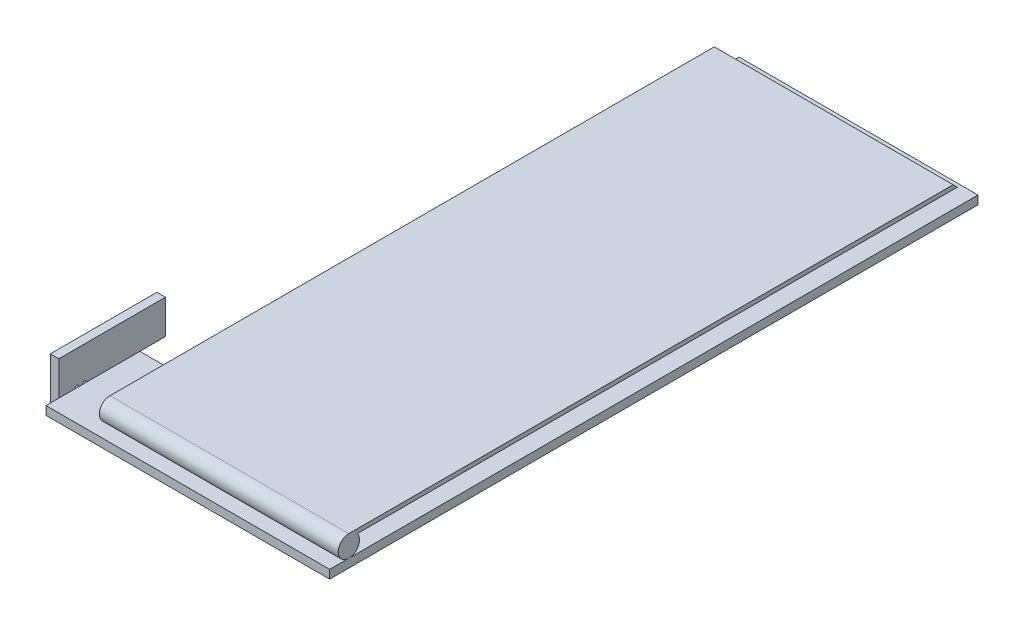
ISO-10303-21;
HEADER;
FILE_DESCRIPTION(('STEP AP214'),'2;1');
FILE_NAME('part.step','',(''),(''),'','','');
FILE_SCHEMA(('AUTOMOTIVE_DESIGN { 1 0 10303 214 1 1 1 1 }'));
ENDSEC;
DATA;
#1=APPLICATION_CONTEXT('core data for automotive mechanical design processes');
#2=APPLICATION_PROTOCOL_DEFINITION('international standard','automotive_design',2000,#1);
#3=PRODUCT_CONTEXT('',#1,'mechanical');
#4=PRODUCT('Part','Part','',(#3));
#5=PRODUCT_RELATED_PRODUCT_CATEGORY('part','',(#4));
#6=PRODUCT_DEFINITION_FORMATION('','',#4);
#7=PRODUCT_DEFINITION_CONTEXT('part definition',#1,'design');
#8=PRODUCT_DEFINITION('design','',#6,#7);
#9=PRODUCT_DEFINITION_SHAPE('','',#8);
#10=(LENGTH_UNIT() NAMED_UNIT(*) SI_UNIT(.MILLI.,.METRE.));
#11=(NAMED_UNIT(*) PLANE_ANGLE_UNIT() SI_UNIT($,.RADIAN.));
#12=(NAMED_UNIT(*) SI_UNIT($,.STERADIAN.) SOLID_ANGLE_UNIT());
#13=UNCERTAINTY_MEASURE_WITH_UNIT(LENGTH_MEASURE(1.E-05),#10,'distance_accuracy_value','');
#14=(GEOMETRIC_REPRESENTATION_CONTEXT(3) GLOBAL_UNCERTAINTY_ASSIGNED_CONTEXT((#13)) GLOBAL_UNIT_ASSIGNED_CONTEXT((#10,
#11,#12)) REPRESENTATION_CONTEXT('',''));
#15=CARTESIAN_POINT('',(0.,0.,0.));
#16=DIRECTION('',(0.,0.,1.));
#17=DIRECTION('',(1.,0.,0.));
#18=AXIS2_PLACEMENT_3D('',#15,#16,#17);
#19=CARTESIAN_POINT('',(38.5,7.,73.));
#20=DIRECTION('',(0.,-1.,0.));
#21=DIRECTION('',(0.,0.,-1.));
#22=AXIS2_PLACEMENT_3D('',#19,#20,#21);
#23=PLANE('',#22);
#24=DIRECTION('',(0.,0.,1.));
#25=VECTOR('',#24,1.);
#26=CARTESIAN_POINT('',(-17.5,7.,73.));
#27=LINE('',#26,#25);
#28=CARTESIAN_POINT('',(-17.5,7.,-68.6715728752541));
#29=VERTEX_POINT('',#28);
#30=CARTESIAN_POINT('',(-17.5,7.,73.));
#31=VERTEX_POINT('',#30);
#32=EDGE_CURVE('E107',#29,#31,#27,.T.);
#33=ORIENTED_EDGE('',*,*,#32,.T.);
#34=DIRECTION('',(-1.,0.,0.));
#35=VECTOR('',#34,1.);
#36=CARTESIAN_POINT('',(38.5,7.,73.));
#37=LINE('',#36,#35);
#38=CARTESIAN_POINT('',(38.5,7.,73.));
#39=VERTEX_POINT('',#38);
#40=EDGE_CURVE('E13',#39,#31,#37,.T.);
#41=ORIENTED_EDGE('',*,*,#40,.F.);
#42=DIRECTION('',(0.,0.,1.));
#43=VECTOR('',#42,1.);
#44=CARTESIAN_POINT('',(38.5,7.,73.));
#45=LINE('',#44,#43);
#46=CARTESIAN_POINT('',(38.5,7.,-68.6715728752541));
#47=VERTEX_POINT('',#46);
#48=EDGE_CURVE('E95',#47,#39,#45,.T.);
#49=ORIENTED_EDGE('',*,*,#48,.F.);
#50=DIRECTION('',(-1.,0.,0.));
#51=VECTOR('',#50,1.);
#52=CARTESIAN_POINT('',(38.5,7.,-68.6715728752541));
#53=LINE('',#52,#51);
#54=EDGE_CURVE('E103',#47,#29,#53,.T.);
#55=ORIENTED_EDGE('',*,*,#54,.T.);
#56=EDGE_LOOP('',(#33,#41,#49,#55));
#57=FACE_BOUND('',#56,.T.);
#58=ADVANCED_FACE('F44',(#57),#23,.F.);
#59=CARTESIAN_POINT('',(38.5,4.5,73.));
#60=DIRECTION('',(-1.,0.,0.));
#61=DIRECTION('',(0.,0.,1.));
#62=AXIS2_PLACEMENT_3D('',#59,#60,#61);
#63=CYLINDRICAL_SURFACE('',#62,2.5);
#64=CARTESIAN_POINT('',(-17.5,4.5,73.));
#65=DIRECTION('',(1.,0.,0.));
#66=DIRECTION('',(0.,0.,-1.));
#67=AXIS2_PLACEMENT_3D('',#64,#65,#66);
#68=CIRCLE('',#67,2.5);
#69=CARTESIAN_POINT('',(-17.5,5.99999999999998,71.));
#70=VERTEX_POINT('',#69);
#71=EDGE_CURVE('E99',#31,#70,#68,.T.);
#72=ORIENTED_EDGE('',*,*,#71,.T.);
#73=DIRECTION('',(-1.,0.,0.));
#74=VECTOR('',#73,1.);
#75=CARTESIAN_POINT('',(38.5,5.99999999999998,71.));
#76=LINE('',#75,#74);
#77=CARTESIAN_POINT('',(38.5,5.99999999999998,71.));
#78=VERTEX_POINT('',#77);
#79=EDGE_CURVE('E52',#78,#70,#76,.T.);
#80=ORIENTED_EDGE('',*,*,#79,.F.);
#81=CARTESIAN_POINT('',(38.5,4.5,73.));
#82=DIRECTION('',(1.,0.,0.));
#83=DIRECTION('',(0.,0.,-1.));
#84=AXIS2_PLACEMENT_3D('',#81,#82,#83);
#85=CIRCLE('',#84,2.5);
#86=EDGE_CURVE('E90',#39,#78,#85,.T.);
#87=ORIENTED_EDGE('',*,*,#86,.F.);
#88=ORIENTED_EDGE('',*,*,#40,.T.);
#89=EDGE_LOOP('',(#72,#80,#87,#88));
#90=FACE_BOUND('',#89,.T.);
#91=ADVANCED_FACE('F98',(#90),#63,.T.);
#92=CARTESIAN_POINT('',(38.5,6.,-69.6715728752541));
#93=DIRECTION('',(0.,1.,0.));
#94=DIRECTION('',(0.,0.,1.));
#95=AXIS2_PLACEMENT_3D('',#92,#93,#94);
#96=PLANE('',#95);
#97=DIRECTION('',(0.,0.,-1.));
#98=VECTOR('',#97,1.);
#99=CARTESIAN_POINT('',(-17.5,6.,-69.6715728752541));
#100=LINE('',#99,#98);
#101=CARTESIAN_POINT('',(-17.5,6.,-69.6715728752541));
#102=VERTEX_POINT('',#101);
#103=EDGE_CURVE('E77',#70,#102,#100,.T.);
#104=ORIENTED_EDGE('',*,*,#103,.T.);
#105=DIRECTION('',(-1.,0.,0.));
#106=VECTOR('',#105,1.);
#107=CARTESIAN_POINT('',(38.5,6.,-69.6715728752541));
#108=LINE('',#107,#106);
#109=CARTESIAN_POINT('',(38.5,6.,-69.6715728752541));
#110=VERTEX_POINT('',#109);
#111=EDGE_CURVE('E100',#110,#102,#108,.T.);
#112=ORIENTED_EDGE('',*,*,#111,.F.);
#113=DIRECTION('',(0.,0.,-1.));
#114=VECTOR('',#113,1.);
#115=CARTESIAN_POINT('',(38.5,6.,-69.6715728752541));
#116=LINE('',#115,#114);
#117=EDGE_CURVE('E93',#78,#110,#116,.T.);
#118=ORIENTED_EDGE('',*,*,#117,.F.);
#119=ORIENTED_EDGE('',*,*,#79,.T.);
#120=EDGE_LOOP('',(#104,#112,#118,#119));
#121=FACE_BOUND('',#120,.T.);
#122=ADVANCED_FACE('F101',(#121),#96,.F.);
#123=CARTESIAN_POINT('',(38.5,7.,-68.6715728752541));
#124=DIRECTION('',(0.,-0.707106781186558,0.707106781186537));
#125=DIRECTION('',(0.,-0.707106781186537,-0.707106781186558));
#126=AXIS2_PLACEMENT_3D('',#123,#124,#125);
#127=PLANE('',#126);
#128=DIRECTION('',(0.,0.707106781186537,0.707106781186558));
#129=VECTOR('',#128,1.);
#130=CARTESIAN_POINT('',(-17.5,7.,-68.6715728752541));
#131=LINE('',#130,#129);
#132=EDGE_CURVE('E83',#102,#29,#131,.T.);
#133=ORIENTED_EDGE('',*,*,#132,.T.);
#134=ORIENTED_EDGE('',*,*,#54,.F.);
#135=DIRECTION('',(0.,0.707106781186537,0.707106781186558));
#136=VECTOR('',#135,1.);
#137=CARTESIAN_POINT('',(38.5,7.,-68.6715728752541));
#138=LINE('',#137,#136);
#139=EDGE_CURVE('E60',#110,#47,#138,.T.);
#140=ORIENTED_EDGE('',*,*,#139,.F.);
#141=ORIENTED_EDGE('',*,*,#111,.T.);
#142=EDGE_LOOP('',(#133,#134,#140,#141));
#143=FACE_BOUND('',#142,.T.);
#144=ADVANCED_FACE('F114',(#143),#127,.F.);
#145=CARTESIAN_POINT('',(38.5,4.5,73.));
#146=DIRECTION('',(1.,0.,0.));
#147=DIRECTION('',(0.,0.,-1.));
#148=AXIS2_PLACEMENT_3D('',#145,#146,#147);
#149=PLANE('',#148);
#150=ORIENTED_EDGE('',*,*,#48,.T.);
#151=ORIENTED_EDGE('',*,*,#86,.T.);
#152=ORIENTED_EDGE('',*,*,#117,.T.);
#153=ORIENTED_EDGE('',*,*,#139,.T.);
#154=EDGE_LOOP('',(#150,#151,#152,#153));
#155=FACE_BOUND('',#154,.T.);
#156=ADVANCED_FACE('F91',(#155),#149,.T.);
#157=CARTESIAN_POINT('',(-17.5,4.5,73.));
#158=DIRECTION('',(1.,0.,0.));
#159=DIRECTION('',(0.,0.,-1.));
#160=AXIS2_PLACEMENT_3D('',#157,#158,#159);
#161=PLANE('',#160);
#162=ORIENTED_EDGE('',*,*,#32,.F.);
#163=ORIENTED_EDGE('',*,*,#132,.F.);
#164=ORIENTED_EDGE('',*,*,#103,.F.);
#165=ORIENTED_EDGE('',*,*,#71,.F.);
#166=EDGE_LOOP('',(#162,#163,#164,#165));
#167=FACE_BOUND('',#166,.T.);
#168=ADVANCED_FACE('F117',(#167),#161,.F.);
#169=CLOSED_SHELL('',(#58,#91,#122,#144,#156,#168));
#170=MANIFOLD_SOLID_BREP('B2',#169);
#171=CARTESIAN_POINT('',(0.,2.,0.));
#172=DIRECTION('',(0.,1.,0.));
#173=DIRECTION('',(0.,0.,1.));
#174=AXIS2_PLACEMENT_3D('',#171,#172,#173);
#175=PLANE('',#174);
#176=DIRECTION('',(-1.,0.,0.));
#177=VECTOR('',#176,1.);
#178=CARTESIAN_POINT('',(-30.,2.,55.5));
#179=LINE('',#178,#177);
#180=CARTESIAN_POINT('',(-17.5031692071306,2.,55.5));
#181=VERTEX_POINT('',#180);
#182=CARTESIAN_POINT('',(-28.,2.,55.5));
#183=VERTEX_POINT('',#182);
#184=EDGE_CURVE('E317',#181,#183,#179,.T.);
#185=ORIENTED_EDGE('',*,*,#184,.T.);
#186=DIRECTION('',(0.,0.,1.));
#187=VECTOR('',#186,1.);
#188=CARTESIAN_POINT('',(-28.,2.,49.5));
#189=LINE('',#188,#187);
#190=CARTESIAN_POINT('',(-28.,2.,68.1196367041319));
#191=VERTEX_POINT('',#190);
#192=EDGE_CURVE('E267',#183,#191,#189,.T.);
#193=ORIENTED_EDGE('',*,*,#192,.T.);
#194=CARTESIAN_POINT('',(-28.,2.,68.791452904263));
#195=VERTEX_POINT('',#194);
#196=EDGE_CURVE('E289',#191,#195,#189,.T.);
#197=ORIENTED_EDGE('',*,*,#196,.T.);
#198=CARTESIAN_POINT('',(-28.,2.,69.9285277432924));
#199=VERTEX_POINT('',#198);
#200=EDGE_CURVE('E288',#195,#199,#189,.T.);
#201=ORIENTED_EDGE('',*,*,#200,.T.);
#202=CARTESIAN_POINT('',(-28.,2.,70.6003439434235));
#203=VERTEX_POINT('',#202);
#204=EDGE_CURVE('E271',#199,#203,#189,.T.);
#205=ORIENTED_EDGE('',*,*,#204,.T.);
#206=CARTESIAN_POINT('',(-28.,2.,74.5));
#207=VERTEX_POINT('',#206);
#208=EDGE_CURVE('E276',#203,#207,#189,.T.);
#209=ORIENTED_EDGE('',*,*,#208,.T.);
#210=DIRECTION('',(0.,0.,1.));
#211=VECTOR('',#210,1.);
#212=CARTESIAN_POINT('',(-28.,2.,74.5));
#213=LINE('',#212,#211);
#214=CARTESIAN_POINT('',(-28.,2.,77.5));
#215=VERTEX_POINT('',#214);
#216=EDGE_CURVE('E319',#207,#215,#213,.T.);
#217=ORIENTED_EDGE('',*,*,#216,.T.);
#218=DIRECTION('',(1.,0.,0.));
#219=VECTOR('',#218,1.);
#220=CARTESIAN_POINT('',(-28.,2.,77.5));
#221=LINE('',#220,#219);
#222=CARTESIAN_POINT('',(38.5,2.,77.5));
#223=VERTEX_POINT('',#222);
#224=EDGE_CURVE('E322',#215,#223,#221,.T.);
#225=ORIENTED_EDGE('',*,*,#224,.T.);
#226=DIRECTION('',(0.,0.,-1.));
#227=VECTOR('',#226,1.);
#228=CARTESIAN_POINT('',(38.5,2.,77.5));
#229=LINE('',#228,#227);
#230=CARTESIAN_POINT('',(38.5,2.,-74.5));
#231=VERTEX_POINT('',#230);
#232=EDGE_CURVE('E324',#223,#231,#229,.T.);
#233=ORIENTED_EDGE('',*,*,#232,.T.);
#234=DIRECTION('',(-1.,0.,0.));
#235=VECTOR('',#234,1.);
#236=CARTESIAN_POINT('',(-17.5031692071306,2.,-74.5));
#237=LINE('',#236,#235);
#238=CARTESIAN_POINT('',(-17.5031692071306,2.,-74.5));
#239=VERTEX_POINT('',#238);
#240=EDGE_CURVE('E326',#231,#239,#237,.T.);
#241=ORIENTED_EDGE('',*,*,#240,.T.);
#242=DIRECTION('',(0.,0.,1.));
#243=VECTOR('',#242,1.);
#244=CARTESIAN_POINT('',(-17.5031692071306,2.,55.5));
#245=LINE('',#244,#243);
#246=EDGE_CURVE('E328',#239,#181,#245,.T.);
#247=ORIENTED_EDGE('',*,*,#246,.T.);
#248=EDGE_LOOP('',(#185,#193,#197,#201,#205,#209,#217,#225,#233,#241,#247));
#249=FACE_BOUND('',#248,.T.);
#250=ADVANCED_FACE('F168',(#249),#175,.T.);
#251=CARTESIAN_POINT('',(-30.,2.,55.5));
#252=DIRECTION('',(0.,0.,1.));
#253=DIRECTION('',(1.,0.,0.));
#254=AXIS2_PLACEMENT_3D('',#251,#252,#253);
#255=PLANE('',#254);
#256=DIRECTION('',(-1.,0.,0.));
#257=VECTOR('',#256,1.);
#258=CARTESIAN_POINT('',(-30.,0.,55.5));
#259=LINE('',#258,#257);
#260=CARTESIAN_POINT('',(-17.5031692071306,0.,55.5));
#261=VERTEX_POINT('',#260);
#262=CARTESIAN_POINT('',(-30.,0.,55.5));
#263=VERTEX_POINT('',#262);
#264=EDGE_CURVE('E312',#261,#263,#259,.T.);
#265=ORIENTED_EDGE('',*,*,#264,.T.);
#266=DIRECTION('',(0.,-1.,0.));
#267=VECTOR('',#266,1.);
#268=CARTESIAN_POINT('',(-30.,2.,55.5));
#269=LINE('',#268,#267);
#270=CARTESIAN_POINT('',(-30.,2.,55.5));
#271=VERTEX_POINT('',#270);
#272=EDGE_CURVE('E283',#271,#263,#269,.T.);
#273=ORIENTED_EDGE('',*,*,#272,.F.);
#274=EDGE_CURVE('E320',#183,#271,#179,.T.);
#275=ORIENTED_EDGE('',*,*,#274,.F.);
#276=ORIENTED_EDGE('',*,*,#184,.F.);
#277=DIRECTION('',(0.,-1.,0.));
#278=VECTOR('',#277,1.);
#279=CARTESIAN_POINT('',(-17.5031692071306,2.,55.5));
#280=LINE('',#279,#278);
#281=EDGE_CURVE('E330',#181,#261,#280,.T.);
#282=ORIENTED_EDGE('',*,*,#281,.T.);
#283=EDGE_LOOP('',(#265,#273,#275,#276,#282));
#284=FACE_BOUND('',#283,.T.);
#285=ADVANCED_FACE('F170',(#284),#255,.F.);
#286=CARTESIAN_POINT('',(-30.,2.,74.5));
#287=DIRECTION('',(1.,0.,0.));
#288=DIRECTION('',(0.,0.,-1.));
#289=AXIS2_PLACEMENT_3D('',#286,#287,#288);
#290=PLANE('',#289);
#291=CARTESIAN_POINT('',(-30.,2.13445499248655,68.4555448041975));
#292=DIRECTION('',(-1.,0.,0.));
#293=DIRECTION('',(0.,0.,1.));
#294=AXIS2_PLACEMENT_3D('',#291,#292,#293);
#295=CIRCLE('',#294,0.361818181818176);
#296=CARTESIAN_POINT('',(-30.,2.13445499248655,68.8173629860156));
#297=VERTEX_POINT('',#296);
#298=EDGE_CURVE('E272',#297,#297,#295,.T.);
#299=ORIENTED_EDGE('',*,*,#298,.F.);
#300=EDGE_LOOP('',(#299));
#301=FACE_BOUND('',#300,.T.);
#302=CARTESIAN_POINT('',(-30.,2.13445499248655,70.264435843358));
#303=DIRECTION('',(-1.,0.,0.));
#304=DIRECTION('',(0.,0.,1.));
#305=AXIS2_PLACEMENT_3D('',#302,#303,#304);
#306=CIRCLE('',#305,0.361818181818176);
#307=CARTESIAN_POINT('',(-30.,2.13445499248655,70.6262540251761));
#308=VERTEX_POINT('',#307);
#309=EDGE_CURVE('E273',#308,#308,#306,.T.);
#310=ORIENTED_EDGE('',*,*,#309,.F.);
#311=EDGE_LOOP('',(#310));
#312=FACE_BOUND('',#311,.T.);
#313=DIRECTION('',(0.,0.,1.));
#314=VECTOR('',#313,1.);
#315=CARTESIAN_POINT('',(-30.,0.,74.5));
#316=LINE('',#315,#314);
#317=CARTESIAN_POINT('',(-30.,0.,74.5));
#318=VERTEX_POINT('',#317);
#319=EDGE_CURVE('E333',#263,#318,#316,.T.);
#320=ORIENTED_EDGE('',*,*,#319,.T.);
#321=DIRECTION('',(0.,-1.,0.));
#322=VECTOR('',#321,1.);
#323=CARTESIAN_POINT('',(-30.,2.,74.5));
#324=LINE('',#323,#322);
#325=CARTESIAN_POINT('',(-30.,10.,74.5));
#326=VERTEX_POINT('',#325);
#327=EDGE_CURVE('E364',#326,#318,#324,.T.);
#328=ORIENTED_EDGE('',*,*,#327,.F.);
#329=DIRECTION('',(0.,0.,-1.));
#330=VECTOR('',#329,1.);
#331=CARTESIAN_POINT('',(-30.,10.,74.5));
#332=LINE('',#331,#330);
#333=CARTESIAN_POINT('',(-30.,10.,49.5));
#334=VERTEX_POINT('',#333);
#335=EDGE_CURVE('E305',#326,#334,#332,.T.);
#336=ORIENTED_EDGE('',*,*,#335,.T.);
#337=DIRECTION('',(0.,-1.,0.));
#338=VECTOR('',#337,1.);
#339=CARTESIAN_POINT('',(-30.,10.,49.5));
#340=LINE('',#339,#338);
#341=CARTESIAN_POINT('',(-30.,2.,49.5));
#342=VERTEX_POINT('',#341);
#343=EDGE_CURVE('E292',#334,#342,#340,.T.);
#344=ORIENTED_EDGE('',*,*,#343,.T.);
#345=DIRECTION('',(0.,0.,1.));
#346=VECTOR('',#345,1.);
#347=CARTESIAN_POINT('',(-30.,2.,49.5));
#348=LINE('',#347,#346);
#349=EDGE_CURVE('E302',#342,#271,#348,.T.);
#350=ORIENTED_EDGE('',*,*,#349,.T.);
#351=ORIENTED_EDGE('',*,*,#272,.T.);
#352=EDGE_LOOP('',(#320,#328,#336,#344,#350,#351));
#353=FACE_BOUND('',#352,.T.);
#354=ADVANCED_FACE('F370',(#301,#312,#353),#290,.F.);
#355=CARTESIAN_POINT('',(-30.,2.,74.5));
#356=DIRECTION('',(0.,0.,-1.));
#357=DIRECTION('',(-1.,0.,0.));
#358=AXIS2_PLACEMENT_3D('',#355,#356,#357);
#359=PLANE('',#358);
#360=DIRECTION('',(1.,0.,0.));
#361=VECTOR('',#360,1.);
#362=CARTESIAN_POINT('',(-30.,0.,74.5));
#363=LINE('',#362,#361);
#364=CARTESIAN_POINT('',(-28.,0.,74.5));
#365=VERTEX_POINT('',#364);
#366=EDGE_CURVE('E335',#318,#365,#363,.T.);
#367=ORIENTED_EDGE('',*,*,#366,.T.);
#368=DIRECTION('',(0.,-1.,0.));
#369=VECTOR('',#368,1.);
#370=CARTESIAN_POINT('',(-28.,2.,74.5));
#371=LINE('',#370,#369);
#372=EDGE_CURVE('E361',#207,#365,#371,.T.);
#373=ORIENTED_EDGE('',*,*,#372,.F.);
#374=DIRECTION('',(0.,1.,0.));
#375=VECTOR('',#374,1.);
#376=CARTESIAN_POINT('',(-28.,2.,74.5));
#377=LINE('',#376,#375);
#378=CARTESIAN_POINT('',(-28.,10.,74.5));
#379=VERTEX_POINT('',#378);
#380=EDGE_CURVE('E280',#207,#379,#377,.T.);
#381=ORIENTED_EDGE('',*,*,#380,.T.);
#382=DIRECTION('',(-1.,0.,0.));
#383=VECTOR('',#382,1.);
#384=CARTESIAN_POINT('',(-28.,10.,74.5));
#385=LINE('',#384,#383);
#386=EDGE_CURVE('E301',#379,#326,#385,.T.);
#387=ORIENTED_EDGE('',*,*,#386,.T.);
#388=ORIENTED_EDGE('',*,*,#327,.T.);
#389=EDGE_LOOP('',(#367,#373,#381,#387,#388));
#390=FACE_BOUND('',#389,.T.);
#391=ADVANCED_FACE('F385',(#390),#359,.F.);
#392=CARTESIAN_POINT('',(-28.,2.,74.5));
#393=DIRECTION('',(1.,0.,0.));
#394=DIRECTION('',(0.,0.,-1.));
#395=AXIS2_PLACEMENT_3D('',#392,#393,#394);
#396=PLANE('',#395);
#397=DIRECTION('',(0.,0.,1.));
#398=VECTOR('',#397,1.);
#399=CARTESIAN_POINT('',(-28.,0.,74.5));
#400=LINE('',#399,#398);
#401=CARTESIAN_POINT('',(-28.,0.,77.5));
#402=VERTEX_POINT('',#401);
#403=EDGE_CURVE('E337',#365,#402,#400,.T.);
#404=ORIENTED_EDGE('',*,*,#403,.T.);
#405=DIRECTION('',(0.,-1.,0.));
#406=VECTOR('',#405,1.);
#407=CARTESIAN_POINT('',(-28.,2.,77.5));
#408=LINE('',#407,#406);
#409=EDGE_CURVE('E358',#215,#402,#408,.T.);
#410=ORIENTED_EDGE('',*,*,#409,.F.);
#411=ORIENTED_EDGE('',*,*,#216,.F.);
#412=ORIENTED_EDGE('',*,*,#372,.T.);
#413=EDGE_LOOP('',(#404,#410,#411,#412));
#414=FACE_BOUND('',#413,.T.);
#415=ADVANCED_FACE('F388',(#414),#396,.F.);
#416=CARTESIAN_POINT('',(-28.,2.,77.5));
#417=DIRECTION('',(0.,0.,-1.));
#418=DIRECTION('',(-1.,0.,0.));
#419=AXIS2_PLACEMENT_3D('',#416,#417,#418);
#420=PLANE('',#419);
#421=DIRECTION('',(1.,0.,0.));
#422=VECTOR('',#421,1.);
#423=CARTESIAN_POINT('',(-28.,0.,77.5));
#424=LINE('',#423,#422);
#425=CARTESIAN_POINT('',(38.5,0.,77.5));
#426=VERTEX_POINT('',#425);
#427=EDGE_CURVE('E339',#402,#426,#424,.T.);
#428=ORIENTED_EDGE('',*,*,#427,.T.);
#429=DIRECTION('',(0.,-1.,0.));
#430=VECTOR('',#429,1.);
#431=CARTESIAN_POINT('',(38.5,2.,77.5));
#432=LINE('',#431,#430);
#433=EDGE_CURVE('E355',#223,#426,#432,.T.);
#434=ORIENTED_EDGE('',*,*,#433,.F.);
#435=ORIENTED_EDGE('',*,*,#224,.F.);
#436=ORIENTED_EDGE('',*,*,#409,.T.);
#437=EDGE_LOOP('',(#428,#434,#435,#436));
#438=FACE_BOUND('',#437,.T.);
#439=ADVANCED_FACE('F395',(#438),#420,.F.);
#440=CARTESIAN_POINT('',(38.5,2.,77.5));
#441=DIRECTION('',(-1.,0.,0.));
#442=DIRECTION('',(0.,0.,1.));
#443=AXIS2_PLACEMENT_3D('',#440,#441,#442);
#444=PLANE('',#443);
#445=DIRECTION('',(0.,0.,-1.));
#446=VECTOR('',#445,1.);
#447=CARTESIAN_POINT('',(38.5,0.,77.5));
#448=LINE('',#447,#446);
#449=CARTESIAN_POINT('',(38.5,0.,-74.5));
#450=VERTEX_POINT('',#449);
#451=EDGE_CURVE('E341',#426,#450,#448,.T.);
#452=ORIENTED_EDGE('',*,*,#451,.T.);
#453=DIRECTION('',(0.,-1.,0.));
#454=VECTOR('',#453,1.);
#455=CARTESIAN_POINT('',(38.5,2.,-74.5));
#456=LINE('',#455,#454);
#457=EDGE_CURVE('E352',#231,#450,#456,.T.);
#458=ORIENTED_EDGE('',*,*,#457,.F.);
#459=ORIENTED_EDGE('',*,*,#232,.F.);
#460=ORIENTED_EDGE('',*,*,#433,.T.);
#461=EDGE_LOOP('',(#452,#458,#459,#460));
#462=FACE_BOUND('',#461,.T.);
#463=ADVANCED_FACE('F398',(#462),#444,.F.);
#464=CARTESIAN_POINT('',(-17.5031692071306,2.,-74.5));
#465=DIRECTION('',(0.,0.,1.));
#466=DIRECTION('',(1.,0.,0.));
#467=AXIS2_PLACEMENT_3D('',#464,#465,#466);
#468=PLANE('',#467);
#469=DIRECTION('',(-1.,0.,0.));
#470=VECTOR('',#469,1.);
#471=CARTESIAN_POINT('',(-17.5031692071306,0.,-74.5));
#472=LINE('',#471,#470);
#473=CARTESIAN_POINT('',(-17.5031692071306,0.,-74.5));
#474=VERTEX_POINT('',#473);
#475=EDGE_CURVE('E343',#450,#474,#472,.T.);
#476=ORIENTED_EDGE('',*,*,#475,.T.);
#477=DIRECTION('',(0.,-1.,0.));
#478=VECTOR('',#477,1.);
#479=CARTESIAN_POINT('',(-17.5031692071306,2.,-74.5));
#480=LINE('',#479,#478);
#481=EDGE_CURVE('E349',#239,#474,#480,.T.);
#482=ORIENTED_EDGE('',*,*,#481,.F.);
#483=ORIENTED_EDGE('',*,*,#240,.F.);
#484=ORIENTED_EDGE('',*,*,#457,.T.);
#485=EDGE_LOOP('',(#476,#482,#483,#484));
#486=FACE_BOUND('',#485,.T.);
#487=ADVANCED_FACE('F402',(#486),#468,.F.);
#488=CARTESIAN_POINT('',(-17.5031692071306,2.,55.5));
#489=DIRECTION('',(1.,0.,0.));
#490=DIRECTION('',(0.,0.,-1.));
#491=AXIS2_PLACEMENT_3D('',#488,#489,#490);
#492=PLANE('',#491);
#493=DIRECTION('',(0.,0.,1.));
#494=VECTOR('',#493,1.);
#495=CARTESIAN_POINT('',(-17.5031692071306,0.,55.5));
#496=LINE('',#495,#494);
#497=EDGE_CURVE('E345',#474,#261,#496,.T.);
#498=ORIENTED_EDGE('',*,*,#497,.T.);
#499=ORIENTED_EDGE('',*,*,#281,.F.);
#500=ORIENTED_EDGE('',*,*,#246,.F.);
#501=ORIENTED_EDGE('',*,*,#481,.T.);
#502=EDGE_LOOP('',(#498,#499,#500,#501));
#503=FACE_BOUND('',#502,.T.);
#504=ADVANCED_FACE('F406',(#503),#492,.F.);
#505=CARTESIAN_POINT('',(0.,0.,0.));
#506=DIRECTION('',(0.,1.,0.));
#507=DIRECTION('',(0.,0.,1.));
#508=AXIS2_PLACEMENT_3D('',#505,#506,#507);
#509=PLANE('',#508);
#510=ORIENTED_EDGE('',*,*,#264,.F.);
#511=ORIENTED_EDGE('',*,*,#497,.F.);
#512=ORIENTED_EDGE('',*,*,#475,.F.);
#513=ORIENTED_EDGE('',*,*,#451,.F.);
#514=ORIENTED_EDGE('',*,*,#427,.F.);
#515=ORIENTED_EDGE('',*,*,#403,.F.);
#516=ORIENTED_EDGE('',*,*,#366,.F.);
#517=ORIENTED_EDGE('',*,*,#319,.F.);
#518=EDGE_LOOP('',(#510,#511,#512,#513,#514,#515,#516,#517));
#519=FACE_BOUND('',#518,.T.);
#520=ADVANCED_FACE('F379',(#519),#509,.F.);
#521=CARTESIAN_POINT('',(-28.,2.,49.5));
#522=DIRECTION('',(0.,-1.,0.));
#523=DIRECTION('',(0.,0.,-1.));
#524=AXIS2_PLACEMENT_3D('',#521,#522,#523);
#525=PLANE('',#524);
#526=CARTESIAN_POINT('',(-28.,2.,49.5));
#527=VERTEX_POINT('',#526);
#528=EDGE_CURVE('E285',#527,#183,#189,.T.);
#529=ORIENTED_EDGE('',*,*,#528,.T.);
#530=ORIENTED_EDGE('',*,*,#274,.T.);
#531=ORIENTED_EDGE('',*,*,#349,.F.);
#532=DIRECTION('',(-1.,0.,0.));
#533=VECTOR('',#532,1.);
#534=CARTESIAN_POINT('',(-28.,2.,49.5));
#535=LINE('',#534,#533);
#536=EDGE_CURVE('E310',#527,#342,#535,.T.);
#537=ORIENTED_EDGE('',*,*,#536,.F.);
#538=EDGE_LOOP('',(#529,#530,#531,#537));
#539=FACE_BOUND('',#538,.T.);
#540=ADVANCED_FACE('F408',(#539),#525,.T.);
#541=CARTESIAN_POINT('',(-28.,10.,49.5));
#542=DIRECTION('',(0.,0.,-1.));
#543=DIRECTION('',(0.,1.,0.));
#544=AXIS2_PLACEMENT_3D('',#541,#542,#543);
#545=PLANE('',#544);
#546=ORIENTED_EDGE('',*,*,#343,.F.);
#547=DIRECTION('',(-1.,0.,0.));
#548=VECTOR('',#547,1.);
#549=CARTESIAN_POINT('',(-28.,10.,49.5));
#550=LINE('',#549,#548);
#551=CARTESIAN_POINT('',(-28.,10.,49.5));
#552=VERTEX_POINT('',#551);
#553=EDGE_CURVE('E313',#552,#334,#550,.T.);
#554=ORIENTED_EDGE('',*,*,#553,.F.);
#555=DIRECTION('',(0.,-1.,0.));
#556=VECTOR('',#555,1.);
#557=CARTESIAN_POINT('',(-28.,10.,49.5));
#558=LINE('',#557,#556);
#559=EDGE_CURVE('E298',#552,#527,#558,.T.);
#560=ORIENTED_EDGE('',*,*,#559,.T.);
#561=ORIENTED_EDGE('',*,*,#536,.T.);
#562=EDGE_LOOP('',(#546,#554,#560,#561));
#563=FACE_BOUND('',#562,.T.);
#564=ADVANCED_FACE('F413',(#563),#545,.T.);
#565=CARTESIAN_POINT('',(-28.,10.,74.5));
#566=DIRECTION('',(0.,1.,0.));
#567=DIRECTION('',(0.,0.,1.));
#568=AXIS2_PLACEMENT_3D('',#565,#566,#567);
#569=PLANE('',#568);
#570=ORIENTED_EDGE('',*,*,#335,.F.);
#571=ORIENTED_EDGE('',*,*,#386,.F.);
#572=DIRECTION('',(0.,0.,-1.));
#573=VECTOR('',#572,1.);
#574=CARTESIAN_POINT('',(-28.,10.,74.5));
#575=LINE('',#574,#573);
#576=EDGE_CURVE('E295',#379,#552,#575,.T.);
#577=ORIENTED_EDGE('',*,*,#576,.T.);
#578=ORIENTED_EDGE('',*,*,#553,.T.);
#579=EDGE_LOOP('',(#570,#571,#577,#578));
#580=FACE_BOUND('',#579,.T.);
#581=ADVANCED_FACE('F416',(#580),#569,.T.);
#582=CARTESIAN_POINT('',(-28.,0.,0.));
#583=DIRECTION('',(-1.,0.,0.));
#584=DIRECTION('',(0.,0.,1.));
#585=AXIS2_PLACEMENT_3D('',#582,#583,#584);
#586=PLANE('',#585);
#587=ORIENTED_EDGE('',*,*,#200,.F.);
#588=CARTESIAN_POINT('',(-28.,2.13445499248655,68.4555448041975));
#589=DIRECTION('',(-1.,0.,0.));
#590=DIRECTION('',(0.,0.,1.));
#591=AXIS2_PLACEMENT_3D('',#588,#589,#590);
#592=CIRCLE('',#591,0.361818181818176);
#593=EDGE_CURVE('E42',#195,#191,#592,.T.);
#594=ORIENTED_EDGE('',*,*,#593,.T.);
#595=ORIENTED_EDGE('',*,*,#192,.F.);
#596=ORIENTED_EDGE('',*,*,#528,.F.);
#597=ORIENTED_EDGE('',*,*,#559,.F.);
#598=ORIENTED_EDGE('',*,*,#576,.F.);
#599=ORIENTED_EDGE('',*,*,#380,.F.);
#600=ORIENTED_EDGE('',*,*,#208,.F.);
#601=CARTESIAN_POINT('',(-28.,2.13445499248655,70.264435843358));
#602=DIRECTION('',(-1.,0.,0.));
#603=DIRECTION('',(0.,0.,1.));
#604=AXIS2_PLACEMENT_3D('',#601,#602,#603);
#605=CIRCLE('',#604,0.361818181818176);
#606=EDGE_CURVE('E176',#203,#199,#605,.T.);
#607=ORIENTED_EDGE('',*,*,#606,.T.);
#608=EDGE_LOOP('',(#587,#594,#595,#596,#597,#598,#599,#600,#607));
#609=FACE_BOUND('',#608,.T.);
#610=ADVANCED_FACE('F277',(#609),#586,.F.);
#611=CARTESIAN_POINT('',(-26.9766236403191,2.13445499248655,70.264435843358));
#612=DIRECTION('',(-1.,0.,0.));
#613=DIRECTION('',(0.,0.,1.));
#614=AXIS2_PLACEMENT_3D('',#611,#612,#613);
#615=CYLINDRICAL_SURFACE('',#614,0.361818181818176);
#616=CARTESIAN_POINT('',(-28.,2.13445499248655,70.264435843358));
#617=DIRECTION('',(-1.,0.,0.));
#618=DIRECTION('',(0.,0.,1.));
#619=AXIS2_PLACEMENT_3D('',#616,#617,#618);
#620=CIRCLE('',#619,0.361818181818176);
#621=EDGE_CURVE('E182',#203,#199,#620,.F.);
#622=ORIENTED_EDGE('',*,*,#621,.T.);
#623=ORIENTED_EDGE('',*,*,#606,.F.);
#624=EDGE_LOOP('',(#622,#623));
#625=FACE_BOUND('',#624,.T.);
#626=ORIENTED_EDGE('',*,*,#309,.T.);
#627=EDGE_LOOP('',(#626));
#628=FACE_BOUND('',#627,.T.);
#629=ADVANCED_FACE('F261',(#625,#628),#615,.F.);
#630=CARTESIAN_POINT('',(-28.,0.,0.));
#631=DIRECTION('',(-1.,0.,0.));
#632=DIRECTION('',(0.,0.,1.));
#633=AXIS2_PLACEMENT_3D('',#630,#631,#632);
#634=PLANE('',#633);
#635=ORIENTED_EDGE('',*,*,#621,.F.);
#636=ORIENTED_EDGE('',*,*,#204,.F.);
#637=EDGE_LOOP('',(#635,#636));
#638=FACE_BOUND('',#637,.T.);
#639=ADVANCED_FACE('F269',(#638),#634,.T.);
#640=CARTESIAN_POINT('',(-26.9766236403191,2.13445499248655,68.4555448041975));
#641=DIRECTION('',(-1.,0.,0.));
#642=DIRECTION('',(0.,0.,1.));
#643=AXIS2_PLACEMENT_3D('',#640,#641,#642);
#644=CYLINDRICAL_SURFACE('',#643,0.361818181818176);
#645=CARTESIAN_POINT('',(-28.,2.13445499248655,68.4555448041975));
#646=DIRECTION('',(-1.,0.,0.));
#647=DIRECTION('',(0.,0.,1.));
#648=AXIS2_PLACEMENT_3D('',#645,#646,#647);
#649=CIRCLE('',#648,0.361818181818176);
#650=EDGE_CURVE('E189',#195,#191,#649,.F.);
#651=ORIENTED_EDGE('',*,*,#650,.T.);
#652=ORIENTED_EDGE('',*,*,#593,.F.);
#653=EDGE_LOOP('',(#651,#652));
#654=FACE_BOUND('',#653,.T.);
#655=ORIENTED_EDGE('',*,*,#298,.T.);
#656=EDGE_LOOP('',(#655));
#657=FACE_BOUND('',#656,.T.);
#658=ADVANCED_FACE('F457',(#654,#657),#644,.F.);
#659=CARTESIAN_POINT('',(-28.,0.,0.));
#660=DIRECTION('',(-1.,0.,0.));
#661=DIRECTION('',(0.,0.,1.));
#662=AXIS2_PLACEMENT_3D('',#659,#660,#661);
#663=PLANE('',#662);
#664=ORIENTED_EDGE('',*,*,#650,.F.);
#665=ORIENTED_EDGE('',*,*,#196,.F.);
#666=EDGE_LOOP('',(#664,#665));
#667=FACE_BOUND('',#666,.T.);
#668=ADVANCED_FACE('F459',(#667),#663,.T.);
#669=CLOSED_SHELL('',(#250,#285,#354,#391,#415,#439,#463,#487,#504,#520,#540,#564,#581,#610,
#629,#639,#658,#668));
#670=MANIFOLD_SOLID_BREP('B7',#669);
#671=ADVANCED_BREP_SHAPE_REPRESENTATION('',(#18,#170,#670),#14);
#672=SHAPE_DEFINITION_REPRESENTATION(#9,#671);
ENDSEC;
END-ISO-10303-21;
